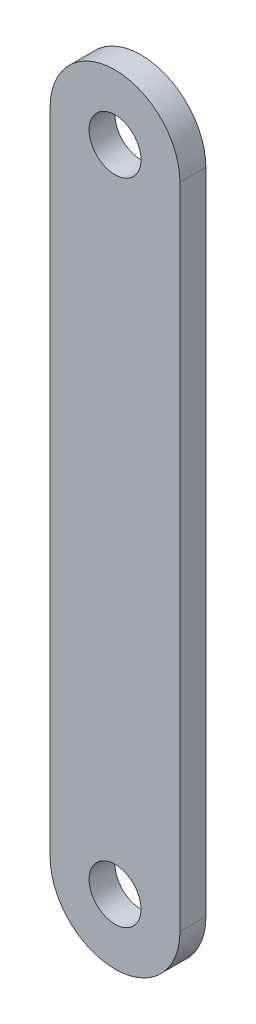
ISO-10303-21;
HEADER;
FILE_DESCRIPTION(('STEP AP214'),'2;1');
FILE_NAME('part.step','',(''),(''),'','','');
FILE_SCHEMA(('AUTOMOTIVE_DESIGN { 1 0 10303 214 1 1 1 1 }'));
ENDSEC;
DATA;
#1=APPLICATION_CONTEXT('core data for automotive mechanical design processes');
#2=APPLICATION_PROTOCOL_DEFINITION('international standard','automotive_design',2000,#1);
#3=PRODUCT_CONTEXT('',#1,'mechanical');
#4=PRODUCT('Part','Part','',(#3));
#5=PRODUCT_RELATED_PRODUCT_CATEGORY('part','',(#4));
#6=PRODUCT_DEFINITION_FORMATION('','',#4);
#7=PRODUCT_DEFINITION_CONTEXT('part definition',#1,'design');
#8=PRODUCT_DEFINITION('design','',#6,#7);
#9=PRODUCT_DEFINITION_SHAPE('','',#8);
#10=(LENGTH_UNIT() NAMED_UNIT(*) SI_UNIT(.MILLI.,.METRE.));
#11=(NAMED_UNIT(*) PLANE_ANGLE_UNIT() SI_UNIT($,.RADIAN.));
#12=(NAMED_UNIT(*) SI_UNIT($,.STERADIAN.) SOLID_ANGLE_UNIT());
#13=UNCERTAINTY_MEASURE_WITH_UNIT(LENGTH_MEASURE(1.E-05),#10,'distance_accuracy_value','');
#14=(GEOMETRIC_REPRESENTATION_CONTEXT(3) GLOBAL_UNCERTAINTY_ASSIGNED_CONTEXT((#13)) GLOBAL_UNIT_ASSIGNED_CONTEXT((#10,
#11,#12)) REPRESENTATION_CONTEXT('',''));
#15=CARTESIAN_POINT('',(0.,0.,0.));
#16=DIRECTION('',(0.,0.,1.));
#17=DIRECTION('',(1.,0.,0.));
#18=AXIS2_PLACEMENT_3D('',#15,#16,#17);
#19=CARTESIAN_POINT('',(0.,-25.,2.));
#20=DIRECTION('',(0.,0.,1.));
#21=DIRECTION('',(1.,0.,0.));
#22=AXIS2_PLACEMENT_3D('',#19,#20,#21);
#23=PLANE('',#22);
#24=CARTESIAN_POINT('',(0.,-25.,2.));
#25=DIRECTION('',(0.,0.,1.));
#26=DIRECTION('',(1.,0.,0.));
#27=AXIS2_PLACEMENT_3D('',#24,#25,#26);
#28=CIRCLE('',#27,2.);
#29=CARTESIAN_POINT('',(2.,-25.,2.));
#30=VERTEX_POINT('',#29);
#31=EDGE_CURVE('E103',#30,#30,#28,.T.);
#32=ORIENTED_EDGE('',*,*,#31,.F.);
#33=EDGE_LOOP('',(#32));
#34=FACE_BOUND('',#33,.T.);
#35=CARTESIAN_POINT('',(0.,-25.,2.));
#36=DIRECTION('',(0.,0.,1.));
#37=DIRECTION('',(1.,0.,0.));
#38=AXIS2_PLACEMENT_3D('',#35,#36,#37);
#39=CIRCLE('',#38,5.);
#40=CARTESIAN_POINT('',(-5.,-25.,2.));
#41=VERTEX_POINT('',#40);
#42=CARTESIAN_POINT('',(5.,-25.,2.));
#43=VERTEX_POINT('',#42);
#44=EDGE_CURVE('E88',#41,#43,#39,.T.);
#45=ORIENTED_EDGE('',*,*,#44,.T.);
#46=DIRECTION('',(0.,1.,0.));
#47=VECTOR('',#46,1.);
#48=CARTESIAN_POINT('',(5.,25.,2.));
#49=LINE('',#48,#47);
#50=CARTESIAN_POINT('',(5.,25.,2.));
#51=VERTEX_POINT('',#50);
#52=EDGE_CURVE('E83',#43,#51,#49,.T.);
#53=ORIENTED_EDGE('',*,*,#52,.T.);
#54=CARTESIAN_POINT('',(0.,25.,2.));
#55=DIRECTION('',(0.,0.,1.));
#56=DIRECTION('',(-1.,0.,0.));
#57=AXIS2_PLACEMENT_3D('',#54,#55,#56);
#58=CIRCLE('',#57,5.);
#59=CARTESIAN_POINT('',(-5.,25.,2.));
#60=VERTEX_POINT('',#59);
#61=EDGE_CURVE('E86',#51,#60,#58,.T.);
#62=ORIENTED_EDGE('',*,*,#61,.T.);
#63=DIRECTION('',(0.,-1.,0.));
#64=VECTOR('',#63,1.);
#65=CARTESIAN_POINT('',(-5.,25.,2.));
#66=LINE('',#65,#64);
#67=EDGE_CURVE('E53',#60,#41,#66,.T.);
#68=ORIENTED_EDGE('',*,*,#67,.T.);
#69=EDGE_LOOP('',(#45,#53,#62,#68));
#70=FACE_BOUND('',#69,.T.);
#71=CARTESIAN_POINT('',(0.,25.,2.));
#72=DIRECTION('',(0.,0.,1.));
#73=DIRECTION('',(1.,0.,0.));
#74=AXIS2_PLACEMENT_3D('',#71,#72,#73);
#75=CIRCLE('',#74,2.);
#76=CARTESIAN_POINT('',(2.,25.,2.));
#77=VERTEX_POINT('',#76);
#78=EDGE_CURVE('E118',#77,#77,#75,.T.);
#79=ORIENTED_EDGE('',*,*,#78,.F.);
#80=EDGE_LOOP('',(#79));
#81=FACE_BOUND('',#80,.T.);
#82=ADVANCED_FACE('F36',(#34,#70,#81),#23,.T.);
#83=CARTESIAN_POINT('',(0.,-25.,0.));
#84=DIRECTION('',(0.,0.,1.));
#85=DIRECTION('',(1.,0.,0.));
#86=AXIS2_PLACEMENT_3D('',#83,#84,#85);
#87=PLANE('',#86);
#88=CARTESIAN_POINT('',(0.,-25.,0.));
#89=DIRECTION('',(0.,0.,1.));
#90=DIRECTION('',(1.,0.,0.));
#91=AXIS2_PLACEMENT_3D('',#88,#89,#90);
#92=CIRCLE('',#91,5.);
#93=CARTESIAN_POINT('',(-5.,-25.,0.));
#94=VERTEX_POINT('',#93);
#95=CARTESIAN_POINT('',(5.,-25.,0.));
#96=VERTEX_POINT('',#95);
#97=EDGE_CURVE('E100',#94,#96,#92,.T.);
#98=ORIENTED_EDGE('',*,*,#97,.F.);
#99=DIRECTION('',(0.,-1.,0.));
#100=VECTOR('',#99,1.);
#101=CARTESIAN_POINT('',(-5.,25.,0.));
#102=LINE('',#101,#100);
#103=CARTESIAN_POINT('',(-5.,25.,0.));
#104=VERTEX_POINT('',#103);
#105=EDGE_CURVE('E76',#104,#94,#102,.T.);
#106=ORIENTED_EDGE('',*,*,#105,.F.);
#107=CARTESIAN_POINT('',(0.,25.,0.));
#108=DIRECTION('',(0.,0.,1.));
#109=DIRECTION('',(-1.,0.,0.));
#110=AXIS2_PLACEMENT_3D('',#107,#108,#109);
#111=CIRCLE('',#110,5.);
#112=CARTESIAN_POINT('',(5.,25.,0.));
#113=VERTEX_POINT('',#112);
#114=EDGE_CURVE('E70',#113,#104,#111,.T.);
#115=ORIENTED_EDGE('',*,*,#114,.F.);
#116=DIRECTION('',(0.,1.,0.));
#117=VECTOR('',#116,1.);
#118=CARTESIAN_POINT('',(5.,25.,0.));
#119=LINE('',#118,#117);
#120=EDGE_CURVE('E92',#96,#113,#119,.T.);
#121=ORIENTED_EDGE('',*,*,#120,.F.);
#122=EDGE_LOOP('',(#98,#106,#115,#121));
#123=FACE_BOUND('',#122,.T.);
#124=CARTESIAN_POINT('',(0.,-25.,0.));
#125=DIRECTION('',(0.,0.,1.));
#126=DIRECTION('',(1.,0.,0.));
#127=AXIS2_PLACEMENT_3D('',#124,#125,#126);
#128=CIRCLE('',#127,2.);
#129=CARTESIAN_POINT('',(2.,-25.,0.));
#130=VERTEX_POINT('',#129);
#131=EDGE_CURVE('E115',#130,#130,#128,.T.);
#132=ORIENTED_EDGE('',*,*,#131,.T.);
#133=EDGE_LOOP('',(#132));
#134=FACE_BOUND('',#133,.T.);
#135=CARTESIAN_POINT('',(0.,25.,0.));
#136=DIRECTION('',(0.,0.,1.));
#137=DIRECTION('',(1.,0.,0.));
#138=AXIS2_PLACEMENT_3D('',#135,#136,#137);
#139=CIRCLE('',#138,2.);
#140=CARTESIAN_POINT('',(2.,25.,0.));
#141=VERTEX_POINT('',#140);
#142=EDGE_CURVE('E121',#141,#141,#139,.T.);
#143=ORIENTED_EDGE('',*,*,#142,.T.);
#144=EDGE_LOOP('',(#143));
#145=FACE_BOUND('',#144,.T.);
#146=ADVANCED_FACE('F111',(#123,#134,#145),#87,.F.);
#147=CARTESIAN_POINT('',(0.,-25.,2.));
#148=DIRECTION('',(0.,0.,-1.));
#149=DIRECTION('',(-1.,0.,0.));
#150=AXIS2_PLACEMENT_3D('',#147,#148,#149);
#151=CYLINDRICAL_SURFACE('',#150,5.);
#152=ORIENTED_EDGE('',*,*,#97,.T.);
#153=DIRECTION('',(0.,0.,-1.));
#154=VECTOR('',#153,1.);
#155=CARTESIAN_POINT('',(5.,-25.,2.));
#156=LINE('',#155,#154);
#157=EDGE_CURVE('E11',#43,#96,#156,.T.);
#158=ORIENTED_EDGE('',*,*,#157,.F.);
#159=ORIENTED_EDGE('',*,*,#44,.F.);
#160=DIRECTION('',(0.,0.,-1.));
#161=VECTOR('',#160,1.);
#162=CARTESIAN_POINT('',(-5.,-25.,2.));
#163=LINE('',#162,#161);
#164=EDGE_CURVE('E96',#41,#94,#163,.T.);
#165=ORIENTED_EDGE('',*,*,#164,.T.);
#166=EDGE_LOOP('',(#152,#158,#159,#165));
#167=FACE_BOUND('',#166,.T.);
#168=ADVANCED_FACE('F38',(#167),#151,.T.);
#169=CARTESIAN_POINT('',(5.,25.,2.));
#170=DIRECTION('',(-1.,0.,0.));
#171=DIRECTION('',(0.,0.,1.));
#172=AXIS2_PLACEMENT_3D('',#169,#170,#171);
#173=PLANE('',#172);
#174=ORIENTED_EDGE('',*,*,#120,.T.);
#175=DIRECTION('',(0.,0.,-1.));
#176=VECTOR('',#175,1.);
#177=CARTESIAN_POINT('',(5.,25.,2.));
#178=LINE('',#177,#176);
#179=EDGE_CURVE('E45',#51,#113,#178,.T.);
#180=ORIENTED_EDGE('',*,*,#179,.F.);
#181=ORIENTED_EDGE('',*,*,#52,.F.);
#182=ORIENTED_EDGE('',*,*,#157,.T.);
#183=EDGE_LOOP('',(#174,#180,#181,#182));
#184=FACE_BOUND('',#183,.T.);
#185=ADVANCED_FACE('F91',(#184),#173,.F.);
#186=CARTESIAN_POINT('',(0.,25.,2.));
#187=DIRECTION('',(0.,0.,-1.));
#188=DIRECTION('',(-1.,0.,0.));
#189=AXIS2_PLACEMENT_3D('',#186,#187,#188);
#190=CYLINDRICAL_SURFACE('',#189,5.);
#191=ORIENTED_EDGE('',*,*,#114,.T.);
#192=DIRECTION('',(0.,0.,-1.));
#193=VECTOR('',#192,1.);
#194=CARTESIAN_POINT('',(-5.,25.,2.));
#195=LINE('',#194,#193);
#196=EDGE_CURVE('E93',#60,#104,#195,.T.);
#197=ORIENTED_EDGE('',*,*,#196,.F.);
#198=ORIENTED_EDGE('',*,*,#61,.F.);
#199=ORIENTED_EDGE('',*,*,#179,.T.);
#200=EDGE_LOOP('',(#191,#197,#198,#199));
#201=FACE_BOUND('',#200,.T.);
#202=ADVANCED_FACE('F94',(#201),#190,.T.);
#203=CARTESIAN_POINT('',(-5.,25.,2.));
#204=DIRECTION('',(1.,0.,0.));
#205=DIRECTION('',(0.,0.,-1.));
#206=AXIS2_PLACEMENT_3D('',#203,#204,#205);
#207=PLANE('',#206);
#208=ORIENTED_EDGE('',*,*,#105,.T.);
#209=ORIENTED_EDGE('',*,*,#164,.F.);
#210=ORIENTED_EDGE('',*,*,#67,.F.);
#211=ORIENTED_EDGE('',*,*,#196,.T.);
#212=EDGE_LOOP('',(#208,#209,#210,#211));
#213=FACE_BOUND('',#212,.T.);
#214=ADVANCED_FACE('F108',(#213),#207,.F.);
#215=CARTESIAN_POINT('',(0.,-25.,2.));
#216=DIRECTION('',(0.,0.,-1.));
#217=DIRECTION('',(-1.,0.,0.));
#218=AXIS2_PLACEMENT_3D('',#215,#216,#217);
#219=CYLINDRICAL_SURFACE('',#218,2.);
#220=ORIENTED_EDGE('',*,*,#31,.T.);
#221=EDGE_LOOP('',(#220));
#222=FACE_BOUND('',#221,.T.);
#223=ORIENTED_EDGE('',*,*,#131,.F.);
#224=EDGE_LOOP('',(#223));
#225=FACE_BOUND('',#224,.T.);
#226=ADVANCED_FACE('F138',(#222,#225),#219,.F.);
#227=CARTESIAN_POINT('',(0.,25.,2.));
#228=DIRECTION('',(0.,0.,-1.));
#229=DIRECTION('',(-1.,0.,0.));
#230=AXIS2_PLACEMENT_3D('',#227,#228,#229);
#231=CYLINDRICAL_SURFACE('',#230,2.);
#232=ORIENTED_EDGE('',*,*,#78,.T.);
#233=EDGE_LOOP('',(#232));
#234=FACE_BOUND('',#233,.T.);
#235=ORIENTED_EDGE('',*,*,#142,.F.);
#236=EDGE_LOOP('',(#235));
#237=FACE_BOUND('',#236,.T.);
#238=ADVANCED_FACE('F127',(#234,#237),#231,.F.);
#239=CLOSED_SHELL('',(#82,#146,#168,#185,#202,#214,#226,#238));
#240=MANIFOLD_SOLID_BREP('B2',#239);
#241=ADVANCED_BREP_SHAPE_REPRESENTATION('',(#18,#240),#14);
#242=SHAPE_DEFINITION_REPRESENTATION(#9,#241);
ENDSEC;
END-ISO-10303-21;
